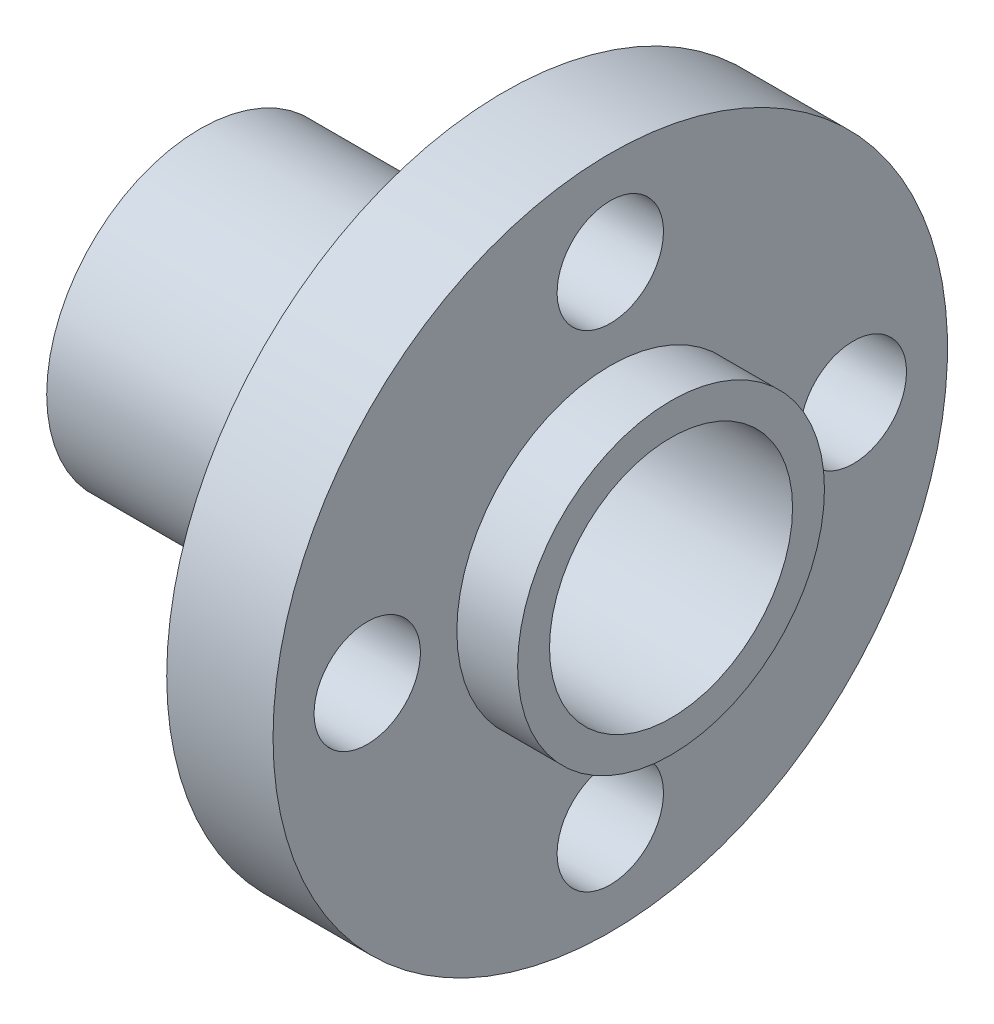
ISO-10303-21;
HEADER;
FILE_DESCRIPTION(('STEP AP214'),'2;1');
FILE_NAME('part.step','',(''),(''),'','','');
FILE_SCHEMA(('AUTOMOTIVE_DESIGN { 1 0 10303 214 1 1 1 1 }'));
ENDSEC;
DATA;
#1=APPLICATION_CONTEXT('core data for automotive mechanical design processes');
#2=APPLICATION_PROTOCOL_DEFINITION('international standard','automotive_design',2000,#1);
#3=PRODUCT_CONTEXT('',#1,'mechanical');
#4=PRODUCT('Part','Part','',(#3));
#5=PRODUCT_RELATED_PRODUCT_CATEGORY('part','',(#4));
#6=PRODUCT_DEFINITION_FORMATION('','',#4);
#7=PRODUCT_DEFINITION_CONTEXT('part definition',#1,'design');
#8=PRODUCT_DEFINITION('design','',#6,#7);
#9=PRODUCT_DEFINITION_SHAPE('','',#8);
#10=(LENGTH_UNIT() NAMED_UNIT(*) SI_UNIT(.MILLI.,.METRE.));
#11=(NAMED_UNIT(*) PLANE_ANGLE_UNIT() SI_UNIT($,.RADIAN.));
#12=(NAMED_UNIT(*) SI_UNIT($,.STERADIAN.) SOLID_ANGLE_UNIT());
#13=UNCERTAINTY_MEASURE_WITH_UNIT(LENGTH_MEASURE(1.E-05),#10,'distance_accuracy_value','');
#14=(GEOMETRIC_REPRESENTATION_CONTEXT(3) GLOBAL_UNCERTAINTY_ASSIGNED_CONTEXT((#13)) GLOBAL_UNIT_ASSIGNED_CONTEXT((#10,
#11,#12)) REPRESENTATION_CONTEXT('',''));
#15=CARTESIAN_POINT('',(0.,0.,0.));
#16=DIRECTION('',(0.,0.,1.));
#17=DIRECTION('',(1.,0.,0.));
#18=AXIS2_PLACEMENT_3D('',#15,#16,#17);
#19=CARTESIAN_POINT('',(13.5,0.,0.));
#20=DIRECTION('',(1.,0.,0.));
#21=DIRECTION('',(0.,0.,-1.));
#22=AXIS2_PLACEMENT_3D('',#19,#20,#21);
#23=PLANE('',#22);
#24=CARTESIAN_POINT('',(13.5,-8.,0.));
#25=DIRECTION('',(1.,0.,0.));
#26=DIRECTION('',(0.,-1.,0.));
#27=AXIS2_PLACEMENT_3D('',#24,#25,#26);
#28=CIRCLE('',#27,1.75);
#29=CARTESIAN_POINT('',(13.5,-9.75,0.));
#30=VERTEX_POINT('',#29);
#31=EDGE_CURVE('E95',#30,#30,#28,.F.);
#32=ORIENTED_EDGE('',*,*,#31,.T.);
#33=EDGE_LOOP('',(#32));
#34=FACE_BOUND('',#33,.T.);
#35=CARTESIAN_POINT('',(13.5,0.,8.));
#36=DIRECTION('',(1.,0.,0.));
#37=DIRECTION('',(0.,0.,1.));
#38=AXIS2_PLACEMENT_3D('',#35,#36,#37);
#39=CIRCLE('',#38,1.75);
#40=CARTESIAN_POINT('',(13.5,0.,9.75));
#41=VERTEX_POINT('',#40);
#42=EDGE_CURVE('E86',#41,#41,#39,.F.);
#43=ORIENTED_EDGE('',*,*,#42,.T.);
#44=EDGE_LOOP('',(#43));
#45=FACE_BOUND('',#44,.T.);
#46=CARTESIAN_POINT('',(13.5,8.,0.));
#47=DIRECTION('',(1.,0.,0.));
#48=DIRECTION('',(0.,1.,0.));
#49=AXIS2_PLACEMENT_3D('',#46,#47,#48);
#50=CIRCLE('',#49,1.75);
#51=CARTESIAN_POINT('',(13.5,9.75,-1.02125829161162E-13));
#52=VERTEX_POINT('',#51);
#53=EDGE_CURVE('E87',#52,#52,#50,.F.);
#54=ORIENTED_EDGE('',*,*,#53,.T.);
#55=EDGE_LOOP('',(#54));
#56=FACE_BOUND('',#55,.T.);
#57=CARTESIAN_POINT('',(13.5,0.,-8.));
#58=DIRECTION('',(1.,0.,0.));
#59=DIRECTION('',(0.,0.,-1.));
#60=AXIS2_PLACEMENT_3D('',#57,#58,#59);
#61=CIRCLE('',#60,1.75);
#62=CARTESIAN_POINT('',(13.5,0.,-9.75));
#63=VERTEX_POINT('',#62);
#64=EDGE_CURVE('E78',#63,#63,#61,.F.);
#65=ORIENTED_EDGE('',*,*,#64,.T.);
#66=EDGE_LOOP('',(#65));
#67=FACE_BOUND('',#66,.T.);
#68=CARTESIAN_POINT('',(13.5,0.,0.));
#69=DIRECTION('',(-1.,0.,0.));
#70=DIRECTION('',(0.,0.,1.));
#71=AXIS2_PLACEMENT_3D('',#68,#69,#70);
#72=CIRCLE('',#71,5.05);
#73=CARTESIAN_POINT('',(13.5,0.,5.05));
#74=VERTEX_POINT('',#73);
#75=EDGE_CURVE('E74',#74,#74,#72,.T.);
#76=ORIENTED_EDGE('',*,*,#75,.T.);
#77=EDGE_LOOP('',(#76));
#78=FACE_BOUND('',#77,.T.);
#79=CARTESIAN_POINT('',(13.5,0.,0.));
#80=DIRECTION('',(-1.,0.,0.));
#81=DIRECTION('',(0.,0.,1.));
#82=AXIS2_PLACEMENT_3D('',#79,#80,#81);
#83=CIRCLE('',#82,11.1);
#84=CARTESIAN_POINT('',(13.5,0.,11.1));
#85=VERTEX_POINT('',#84);
#86=EDGE_CURVE('E10',#85,#85,#83,.T.);
#87=ORIENTED_EDGE('',*,*,#86,.F.);
#88=EDGE_LOOP('',(#87));
#89=FACE_BOUND('',#88,.T.);
#90=ADVANCED_FACE('F39',(#34,#45,#56,#67,#78,#89),#23,.T.);
#91=CARTESIAN_POINT('',(0.,0.,0.));
#92=DIRECTION('',(-1.,0.,0.));
#93=DIRECTION('',(0.,0.,1.));
#94=AXIS2_PLACEMENT_3D('',#91,#92,#93);
#95=CYLINDRICAL_SURFACE('',#94,11.1);
#96=ORIENTED_EDGE('',*,*,#86,.T.);
#97=EDGE_LOOP('',(#96));
#98=FACE_BOUND('',#97,.T.);
#99=CARTESIAN_POINT('',(10.,0.,0.));
#100=DIRECTION('',(-1.,0.,0.));
#101=DIRECTION('',(0.,0.,1.));
#102=AXIS2_PLACEMENT_3D('',#99,#100,#101);
#103=CIRCLE('',#102,11.1);
#104=CARTESIAN_POINT('',(10.,0.,11.1));
#105=VERTEX_POINT('',#104);
#106=EDGE_CURVE('E47',#105,#105,#103,.T.);
#107=ORIENTED_EDGE('',*,*,#106,.F.);
#108=EDGE_LOOP('',(#107));
#109=FACE_BOUND('',#108,.T.);
#110=ADVANCED_FACE('F120',(#98,#109),#95,.T.);
#111=CARTESIAN_POINT('',(10.,0.,0.));
#112=DIRECTION('',(1.,0.,0.));
#113=DIRECTION('',(0.,0.,-1.));
#114=AXIS2_PLACEMENT_3D('',#111,#112,#113);
#115=PLANE('',#114);
#116=CARTESIAN_POINT('',(10.,-8.,0.));
#117=DIRECTION('',(1.,0.,0.));
#118=DIRECTION('',(0.,-1.,0.));
#119=AXIS2_PLACEMENT_3D('',#116,#117,#118);
#120=CIRCLE('',#119,1.75);
#121=CARTESIAN_POINT('',(10.,-9.75,0.));
#122=VERTEX_POINT('',#121);
#123=EDGE_CURVE('E99',#122,#122,#120,.F.);
#124=ORIENTED_EDGE('',*,*,#123,.F.);
#125=EDGE_LOOP('',(#124));
#126=FACE_BOUND('',#125,.T.);
#127=CARTESIAN_POINT('',(10.,0.,8.));
#128=DIRECTION('',(1.,0.,0.));
#129=DIRECTION('',(0.,0.,1.));
#130=AXIS2_PLACEMENT_3D('',#127,#128,#129);
#131=CIRCLE('',#130,1.75);
#132=CARTESIAN_POINT('',(10.,0.,9.75));
#133=VERTEX_POINT('',#132);
#134=EDGE_CURVE('E91',#133,#133,#131,.F.);
#135=ORIENTED_EDGE('',*,*,#134,.F.);
#136=EDGE_LOOP('',(#135));
#137=FACE_BOUND('',#136,.T.);
#138=CARTESIAN_POINT('',(10.,8.,0.));
#139=DIRECTION('',(1.,0.,0.));
#140=DIRECTION('',(0.,1.,0.));
#141=AXIS2_PLACEMENT_3D('',#138,#139,#140);
#142=CIRCLE('',#141,1.75);
#143=CARTESIAN_POINT('',(10.,9.75,-1.02125829161162E-13));
#144=VERTEX_POINT('',#143);
#145=EDGE_CURVE('E82',#144,#144,#142,.F.);
#146=ORIENTED_EDGE('',*,*,#145,.F.);
#147=EDGE_LOOP('',(#146));
#148=FACE_BOUND('',#147,.T.);
#149=CARTESIAN_POINT('',(10.,0.,-8.));
#150=DIRECTION('',(1.,0.,0.));
#151=DIRECTION('',(0.,0.,-1.));
#152=AXIS2_PLACEMENT_3D('',#149,#150,#151);
#153=CIRCLE('',#152,1.75);
#154=CARTESIAN_POINT('',(10.,0.,-9.75));
#155=VERTEX_POINT('',#154);
#156=EDGE_CURVE('E42',#155,#155,#153,.F.);
#157=ORIENTED_EDGE('',*,*,#156,.F.);
#158=EDGE_LOOP('',(#157));
#159=FACE_BOUND('',#158,.T.);
#160=CARTESIAN_POINT('',(10.,0.,0.));
#161=DIRECTION('',(-1.,0.,0.));
#162=DIRECTION('',(0.,0.,1.));
#163=AXIS2_PLACEMENT_3D('',#160,#161,#162);
#164=CIRCLE('',#163,5.05);
#165=CARTESIAN_POINT('',(10.,0.,5.05));
#166=VERTEX_POINT('',#165);
#167=EDGE_CURVE('E52',#166,#166,#164,.T.);
#168=ORIENTED_EDGE('',*,*,#167,.F.);
#169=EDGE_LOOP('',(#168));
#170=FACE_BOUND('',#169,.T.);
#171=ORIENTED_EDGE('',*,*,#106,.T.);
#172=EDGE_LOOP('',(#171));
#173=FACE_BOUND('',#172,.T.);
#174=ADVANCED_FACE('F116',(#126,#137,#148,#159,#170,#173),#115,.F.);
#175=CARTESIAN_POINT('',(0.,0.,0.));
#176=DIRECTION('',(-1.,0.,0.));
#177=DIRECTION('',(0.,0.,1.));
#178=AXIS2_PLACEMENT_3D('',#175,#176,#177);
#179=CYLINDRICAL_SURFACE('',#178,5.05);
#180=CARTESIAN_POINT('',(0.,0.,0.));
#181=DIRECTION('',(-1.,0.,0.));
#182=DIRECTION('',(0.,0.,1.));
#183=AXIS2_PLACEMENT_3D('',#180,#181,#182);
#184=CIRCLE('',#183,5.05);
#185=CARTESIAN_POINT('',(0.,0.,5.05));
#186=VERTEX_POINT('',#185);
#187=EDGE_CURVE('E58',#186,#186,#184,.T.);
#188=ORIENTED_EDGE('',*,*,#187,.F.);
#189=EDGE_LOOP('',(#188));
#190=FACE_BOUND('',#189,.T.);
#191=ORIENTED_EDGE('',*,*,#167,.T.);
#192=EDGE_LOOP('',(#191));
#193=FACE_BOUND('',#192,.T.);
#194=ADVANCED_FACE('F119',(#190,#193),#179,.T.);
#195=CARTESIAN_POINT('',(0.,0.,0.));
#196=DIRECTION('',(1.,0.,0.));
#197=DIRECTION('',(0.,0.,-1.));
#198=AXIS2_PLACEMENT_3D('',#195,#196,#197);
#199=PLANE('',#198);
#200=CARTESIAN_POINT('',(0.,0.,0.));
#201=DIRECTION('',(-1.,0.,0.));
#202=DIRECTION('',(0.,0.,1.));
#203=AXIS2_PLACEMENT_3D('',#200,#201,#202);
#204=CIRCLE('',#203,4.);
#205=CARTESIAN_POINT('',(0.,0.,4.));
#206=VERTEX_POINT('',#205);
#207=EDGE_CURVE('E62',#206,#206,#204,.T.);
#208=ORIENTED_EDGE('',*,*,#207,.F.);
#209=EDGE_LOOP('',(#208));
#210=FACE_BOUND('',#209,.T.);
#211=ORIENTED_EDGE('',*,*,#187,.T.);
#212=EDGE_LOOP('',(#211));
#213=FACE_BOUND('',#212,.T.);
#214=ADVANCED_FACE('F138',(#210,#213),#199,.F.);
#215=CARTESIAN_POINT('',(0.,0.,0.));
#216=DIRECTION('',(-1.,0.,0.));
#217=DIRECTION('',(0.,0.,1.));
#218=AXIS2_PLACEMENT_3D('',#215,#216,#217);
#219=CYLINDRICAL_SURFACE('',#218,4.);
#220=CARTESIAN_POINT('',(15.5,0.,0.));
#221=DIRECTION('',(-1.,0.,0.));
#222=DIRECTION('',(0.,0.,1.));
#223=AXIS2_PLACEMENT_3D('',#220,#221,#222);
#224=CIRCLE('',#223,4.);
#225=CARTESIAN_POINT('',(15.5,0.,4.));
#226=VERTEX_POINT('',#225);
#227=EDGE_CURVE('E66',#226,#226,#224,.T.);
#228=ORIENTED_EDGE('',*,*,#227,.F.);
#229=EDGE_LOOP('',(#228));
#230=FACE_BOUND('',#229,.T.);
#231=ORIENTED_EDGE('',*,*,#207,.T.);
#232=EDGE_LOOP('',(#231));
#233=FACE_BOUND('',#232,.T.);
#234=ADVANCED_FACE('F141',(#230,#233),#219,.F.);
#235=CARTESIAN_POINT('',(15.5,0.,0.));
#236=DIRECTION('',(-1.,0.,0.));
#237=DIRECTION('',(0.,0.,1.));
#238=AXIS2_PLACEMENT_3D('',#235,#236,#237);
#239=PLANE('',#238);
#240=CARTESIAN_POINT('',(15.5,0.,0.));
#241=DIRECTION('',(-1.,0.,0.));
#242=DIRECTION('',(0.,0.,1.));
#243=AXIS2_PLACEMENT_3D('',#240,#241,#242);
#244=CIRCLE('',#243,5.05);
#245=CARTESIAN_POINT('',(15.5,0.,5.05));
#246=VERTEX_POINT('',#245);
#247=EDGE_CURVE('E70',#246,#246,#244,.T.);
#248=ORIENTED_EDGE('',*,*,#247,.F.);
#249=EDGE_LOOP('',(#248));
#250=FACE_BOUND('',#249,.T.);
#251=ORIENTED_EDGE('',*,*,#227,.T.);
#252=EDGE_LOOP('',(#251));
#253=FACE_BOUND('',#252,.T.);
#254=ADVANCED_FACE('F145',(#250,#253),#239,.F.);
#255=ORIENTED_EDGE('',*,*,#75,.F.);
#256=EDGE_LOOP('',(#255));
#257=FACE_BOUND('',#256,.T.);
#258=ORIENTED_EDGE('',*,*,#247,.T.);
#259=EDGE_LOOP('',(#258));
#260=FACE_BOUND('',#259,.T.);
#261=ADVANCED_FACE('F149',(#257,#260),#179,.T.);
#262=CARTESIAN_POINT('',(15.5,0.,-8.));
#263=DIRECTION('',(-1.,0.,0.));
#264=DIRECTION('',(0.,0.,1.));
#265=AXIS2_PLACEMENT_3D('',#262,#263,#264);
#266=CYLINDRICAL_SURFACE('',#265,1.75);
#267=ORIENTED_EDGE('',*,*,#64,.F.);
#268=EDGE_LOOP('',(#267));
#269=FACE_BOUND('',#268,.T.);
#270=ORIENTED_EDGE('',*,*,#156,.T.);
#271=EDGE_LOOP('',(#270));
#272=FACE_BOUND('',#271,.T.);
#273=ADVANCED_FACE('F153',(#269,#272),#266,.F.);
#274=CARTESIAN_POINT('',(15.5,8.,0.));
#275=DIRECTION('',(-1.,0.,0.));
#276=DIRECTION('',(0.,-1.,0.));
#277=AXIS2_PLACEMENT_3D('',#274,#275,#276);
#278=CYLINDRICAL_SURFACE('',#277,1.75);
#279=ORIENTED_EDGE('',*,*,#53,.F.);
#280=EDGE_LOOP('',(#279));
#281=FACE_BOUND('',#280,.T.);
#282=ORIENTED_EDGE('',*,*,#145,.T.);
#283=EDGE_LOOP('',(#282));
#284=FACE_BOUND('',#283,.T.);
#285=ADVANCED_FACE('F157',(#281,#284),#278,.F.);
#286=CARTESIAN_POINT('',(15.5,0.,8.));
#287=DIRECTION('',(-1.,0.,0.));
#288=DIRECTION('',(0.,0.,-1.));
#289=AXIS2_PLACEMENT_3D('',#286,#287,#288);
#290=CYLINDRICAL_SURFACE('',#289,1.75);
#291=ORIENTED_EDGE('',*,*,#42,.F.);
#292=EDGE_LOOP('',(#291));
#293=FACE_BOUND('',#292,.T.);
#294=ORIENTED_EDGE('',*,*,#134,.T.);
#295=EDGE_LOOP('',(#294));
#296=FACE_BOUND('',#295,.T.);
#297=ADVANCED_FACE('F112',(#293,#296),#290,.F.);
#298=CARTESIAN_POINT('',(15.5,-8.,0.));
#299=DIRECTION('',(-1.,0.,0.));
#300=DIRECTION('',(0.,1.,0.));
#301=AXIS2_PLACEMENT_3D('',#298,#299,#300);
#302=CYLINDRICAL_SURFACE('',#301,1.75);
#303=ORIENTED_EDGE('',*,*,#31,.F.);
#304=EDGE_LOOP('',(#303));
#305=FACE_BOUND('',#304,.T.);
#306=ORIENTED_EDGE('',*,*,#123,.T.);
#307=EDGE_LOOP('',(#306));
#308=FACE_BOUND('',#307,.T.);
#309=ADVANCED_FACE('F109',(#305,#308),#302,.F.);
#310=CLOSED_SHELL('',(#90,#110,#174,#194,#214,#234,#254,#261,#273,#285,#297,#309));
#311=MANIFOLD_SOLID_BREP('B2',#310);
#312=ADVANCED_BREP_SHAPE_REPRESENTATION('',(#18,#311),#14);
#313=SHAPE_DEFINITION_REPRESENTATION(#9,#312);
ENDSEC;
END-ISO-10303-21;
